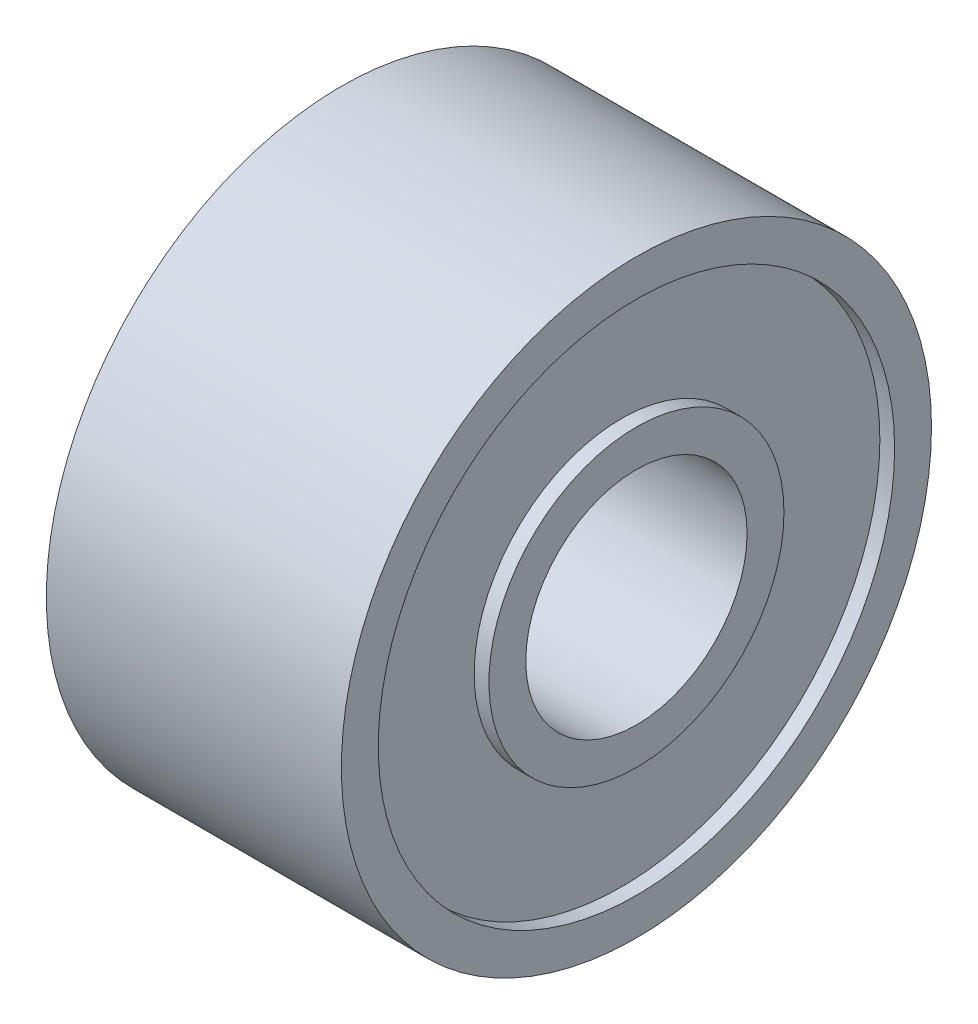
ISO-10303-21;
HEADER;
FILE_DESCRIPTION(('STEP AP214'),'2;1');
FILE_NAME('part.step','',(''),(''),'','','');
FILE_SCHEMA(('AUTOMOTIVE_DESIGN { 1 0 10303 214 1 1 1 1 }'));
ENDSEC;
DATA;
#1=APPLICATION_CONTEXT('core data for automotive mechanical design processes');
#2=APPLICATION_PROTOCOL_DEFINITION('international standard','automotive_design',2000,#1);
#3=PRODUCT_CONTEXT('',#1,'mechanical');
#4=PRODUCT('Part','Part','',(#3));
#5=PRODUCT_RELATED_PRODUCT_CATEGORY('part','',(#4));
#6=PRODUCT_DEFINITION_FORMATION('','',#4);
#7=PRODUCT_DEFINITION_CONTEXT('part definition',#1,'design');
#8=PRODUCT_DEFINITION('design','',#6,#7);
#9=PRODUCT_DEFINITION_SHAPE('','',#8);
#10=(LENGTH_UNIT() NAMED_UNIT(*) SI_UNIT(.MILLI.,.METRE.));
#11=(NAMED_UNIT(*) PLANE_ANGLE_UNIT() SI_UNIT($,.RADIAN.));
#12=(NAMED_UNIT(*) SI_UNIT($,.STERADIAN.) SOLID_ANGLE_UNIT());
#13=UNCERTAINTY_MEASURE_WITH_UNIT(LENGTH_MEASURE(1.E-05),#10,'distance_accuracy_value','');
#14=(GEOMETRIC_REPRESENTATION_CONTEXT(3) GLOBAL_UNCERTAINTY_ASSIGNED_CONTEXT((#13)) GLOBAL_UNIT_ASSIGNED_CONTEXT((#10,
#11,#12)) REPRESENTATION_CONTEXT('',''));
#15=CARTESIAN_POINT('',(0.,0.,0.));
#16=DIRECTION('',(0.,0.,1.));
#17=DIRECTION('',(1.,0.,0.));
#18=AXIS2_PLACEMENT_3D('',#15,#16,#17);
#19=CARTESIAN_POINT('',(0.,0.,0.));
#20=DIRECTION('',(1.,0.,0.));
#21=DIRECTION('',(0.,0.,-1.));
#22=AXIS2_PLACEMENT_3D('',#19,#20,#21);
#23=PLANE('',#22);
#24=CARTESIAN_POINT('',(0.,0.,0.));
#25=DIRECTION('',(1.,0.,0.));
#26=DIRECTION('',(0.,0.,-1.));
#27=AXIS2_PLACEMENT_3D('',#24,#25,#26);
#28=CIRCLE('',#27,1.5);
#29=CARTESIAN_POINT('',(0.,0.,-1.5));
#30=VERTEX_POINT('',#29);
#31=EDGE_CURVE('E44',#30,#30,#28,.T.);
#32=ORIENTED_EDGE('',*,*,#31,.T.);
#33=EDGE_LOOP('',(#32));
#34=FACE_BOUND('',#33,.T.);
#35=CARTESIAN_POINT('',(0.,0.,0.));
#36=DIRECTION('',(-1.,0.,0.));
#37=DIRECTION('',(0.,0.,1.));
#38=AXIS2_PLACEMENT_3D('',#35,#36,#37);
#39=CIRCLE('',#38,2.);
#40=CARTESIAN_POINT('',(0.,0.,2.));
#41=VERTEX_POINT('',#40);
#42=EDGE_CURVE('E68',#41,#41,#39,.T.);
#43=ORIENTED_EDGE('',*,*,#42,.T.);
#44=EDGE_LOOP('',(#43));
#45=FACE_BOUND('',#44,.T.);
#46=ADVANCED_FACE('F31',(#34,#45),#23,.F.);
#47=CARTESIAN_POINT('',(4.,0.,0.));
#48=DIRECTION('',(1.,0.,0.));
#49=DIRECTION('',(0.,0.,-1.));
#50=AXIS2_PLACEMENT_3D('',#47,#48,#49);
#51=PLANE('',#50);
#52=CARTESIAN_POINT('',(4.,0.,0.));
#53=DIRECTION('',(1.,0.,0.));
#54=DIRECTION('',(0.,0.,-1.));
#55=AXIS2_PLACEMENT_3D('',#52,#53,#54);
#56=CIRCLE('',#55,1.5);
#57=CARTESIAN_POINT('',(4.,0.,-1.5));
#58=VERTEX_POINT('',#57);
#59=EDGE_CURVE('E42',#58,#58,#56,.T.);
#60=ORIENTED_EDGE('',*,*,#59,.F.);
#61=EDGE_LOOP('',(#60));
#62=FACE_BOUND('',#61,.T.);
#63=CARTESIAN_POINT('',(4.,0.,0.));
#64=DIRECTION('',(1.,0.,0.));
#65=DIRECTION('',(0.,0.,-1.));
#66=AXIS2_PLACEMENT_3D('',#63,#64,#65);
#67=CIRCLE('',#66,2.);
#68=CARTESIAN_POINT('',(4.,0.,-2.));
#69=VERTEX_POINT('',#68);
#70=EDGE_CURVE('E56',#69,#69,#67,.T.);
#71=ORIENTED_EDGE('',*,*,#70,.T.);
#72=EDGE_LOOP('',(#71));
#73=FACE_BOUND('',#72,.T.);
#74=ADVANCED_FACE('F106',(#62,#73),#51,.T.);
#75=CARTESIAN_POINT('',(4.,0.,0.));
#76=DIRECTION('',(1.,0.,0.));
#77=DIRECTION('',(0.,0.,-1.));
#78=AXIS2_PLACEMENT_3D('',#75,#76,#77);
#79=CIRCLE('',#78,3.5);
#80=CARTESIAN_POINT('',(4.,0.,-3.5));
#81=VERTEX_POINT('',#80);
#82=EDGE_CURVE('E50',#81,#81,#79,.T.);
#83=ORIENTED_EDGE('',*,*,#82,.F.);
#84=EDGE_LOOP('',(#83));
#85=FACE_BOUND('',#84,.T.);
#86=CARTESIAN_POINT('',(4.,0.,0.));
#87=DIRECTION('',(1.,0.,0.));
#88=DIRECTION('',(0.,0.,-1.));
#89=AXIS2_PLACEMENT_3D('',#86,#87,#88);
#90=CIRCLE('',#89,4.);
#91=CARTESIAN_POINT('',(4.,0.,-4.));
#92=VERTEX_POINT('',#91);
#93=EDGE_CURVE('E10',#92,#92,#90,.T.);
#94=ORIENTED_EDGE('',*,*,#93,.T.);
#95=EDGE_LOOP('',(#94));
#96=FACE_BOUND('',#95,.T.);
#97=ADVANCED_FACE('F93',(#85,#96),#51,.T.);
#98=CARTESIAN_POINT('',(0.,0.,0.));
#99=DIRECTION('',(-1.,0.,0.));
#100=DIRECTION('',(0.,0.,1.));
#101=AXIS2_PLACEMENT_3D('',#98,#99,#100);
#102=CIRCLE('',#101,3.5);
#103=CARTESIAN_POINT('',(0.,0.,3.5));
#104=VERTEX_POINT('',#103);
#105=EDGE_CURVE('E62',#104,#104,#102,.T.);
#106=ORIENTED_EDGE('',*,*,#105,.F.);
#107=EDGE_LOOP('',(#106));
#108=FACE_BOUND('',#107,.T.);
#109=CARTESIAN_POINT('',(0.,0.,0.));
#110=DIRECTION('',(1.,0.,0.));
#111=DIRECTION('',(0.,0.,-1.));
#112=AXIS2_PLACEMENT_3D('',#109,#110,#111);
#113=CIRCLE('',#112,4.);
#114=CARTESIAN_POINT('',(0.,0.,-4.));
#115=VERTEX_POINT('',#114);
#116=EDGE_CURVE('E35',#115,#115,#113,.T.);
#117=ORIENTED_EDGE('',*,*,#116,.F.);
#118=EDGE_LOOP('',(#117));
#119=FACE_BOUND('',#118,.T.);
#120=ADVANCED_FACE('F90',(#108,#119),#23,.F.);
#121=CARTESIAN_POINT('',(4.,0.,0.));
#122=DIRECTION('',(-1.,0.,0.));
#123=DIRECTION('',(0.,0.,1.));
#124=AXIS2_PLACEMENT_3D('',#121,#122,#123);
#125=CYLINDRICAL_SURFACE('',#124,4.);
#126=ORIENTED_EDGE('',*,*,#93,.F.);
#127=EDGE_LOOP('',(#126));
#128=FACE_BOUND('',#127,.T.);
#129=ORIENTED_EDGE('',*,*,#116,.T.);
#130=EDGE_LOOP('',(#129));
#131=FACE_BOUND('',#130,.T.);
#132=ADVANCED_FACE('F33',(#128,#131),#125,.T.);
#133=CARTESIAN_POINT('',(4.,0.,0.));
#134=DIRECTION('',(-1.,0.,0.));
#135=DIRECTION('',(0.,0.,1.));
#136=AXIS2_PLACEMENT_3D('',#133,#134,#135);
#137=CYLINDRICAL_SURFACE('',#136,1.5);
#138=ORIENTED_EDGE('',*,*,#59,.T.);
#139=EDGE_LOOP('',(#138));
#140=FACE_BOUND('',#139,.T.);
#141=ORIENTED_EDGE('',*,*,#31,.F.);
#142=EDGE_LOOP('',(#141));
#143=FACE_BOUND('',#142,.T.);
#144=ADVANCED_FACE('F97',(#140,#143),#137,.F.);
#145=CARTESIAN_POINT('',(3.8,0.,0.));
#146=DIRECTION('',(1.,0.,0.));
#147=DIRECTION('',(0.,0.,-1.));
#148=AXIS2_PLACEMENT_3D('',#145,#146,#147);
#149=CYLINDRICAL_SURFACE('',#148,3.5);
#150=CARTESIAN_POINT('',(3.8,0.,0.));
#151=DIRECTION('',(1.,0.,0.));
#152=DIRECTION('',(0.,0.,-1.));
#153=AXIS2_PLACEMENT_3D('',#150,#151,#152);
#154=CIRCLE('',#153,3.5);
#155=CARTESIAN_POINT('',(3.8,0.,-3.5));
#156=VERTEX_POINT('',#155);
#157=EDGE_CURVE('E47',#156,#156,#154,.T.);
#158=ORIENTED_EDGE('',*,*,#157,.F.);
#159=EDGE_LOOP('',(#158));
#160=FACE_BOUND('',#159,.T.);
#161=ORIENTED_EDGE('',*,*,#82,.T.);
#162=EDGE_LOOP('',(#161));
#163=FACE_BOUND('',#162,.T.);
#164=ADVANCED_FACE('F102',(#160,#163),#149,.F.);
#165=CARTESIAN_POINT('',(3.8,0.,0.));
#166=DIRECTION('',(1.,0.,0.));
#167=DIRECTION('',(0.,0.,-1.));
#168=AXIS2_PLACEMENT_3D('',#165,#166,#167);
#169=PLANE('',#168);
#170=CARTESIAN_POINT('',(3.8,0.,0.));
#171=DIRECTION('',(1.,0.,0.));
#172=DIRECTION('',(0.,0.,-1.));
#173=AXIS2_PLACEMENT_3D('',#170,#171,#172);
#174=CIRCLE('',#173,2.);
#175=CARTESIAN_POINT('',(3.8,0.,-2.));
#176=VERTEX_POINT('',#175);
#177=EDGE_CURVE('E53',#176,#176,#174,.T.);
#178=ORIENTED_EDGE('',*,*,#177,.F.);
#179=EDGE_LOOP('',(#178));
#180=FACE_BOUND('',#179,.T.);
#181=ORIENTED_EDGE('',*,*,#157,.T.);
#182=EDGE_LOOP('',(#181));
#183=FACE_BOUND('',#182,.T.);
#184=ADVANCED_FACE('F119',(#180,#183),#169,.T.);
#185=CARTESIAN_POINT('',(3.8,0.,0.));
#186=DIRECTION('',(1.,0.,0.));
#187=DIRECTION('',(0.,0.,-1.));
#188=AXIS2_PLACEMENT_3D('',#185,#186,#187);
#189=CYLINDRICAL_SURFACE('',#188,2.);
#190=ORIENTED_EDGE('',*,*,#177,.T.);
#191=EDGE_LOOP('',(#190));
#192=FACE_BOUND('',#191,.T.);
#193=ORIENTED_EDGE('',*,*,#70,.F.);
#194=EDGE_LOOP('',(#193));
#195=FACE_BOUND('',#194,.T.);
#196=ADVANCED_FACE('F86',(#192,#195),#189,.T.);
#197=CARTESIAN_POINT('',(0.2,0.,0.));
#198=DIRECTION('',(-1.,0.,0.));
#199=DIRECTION('',(0.,0.,1.));
#200=AXIS2_PLACEMENT_3D('',#197,#198,#199);
#201=CYLINDRICAL_SURFACE('',#200,3.5);
#202=CARTESIAN_POINT('',(0.2,0.,0.));
#203=DIRECTION('',(-1.,0.,0.));
#204=DIRECTION('',(0.,0.,1.));
#205=AXIS2_PLACEMENT_3D('',#202,#203,#204);
#206=CIRCLE('',#205,3.5);
#207=CARTESIAN_POINT('',(0.2,0.,3.5));
#208=VERTEX_POINT('',#207);
#209=EDGE_CURVE('E59',#208,#208,#206,.T.);
#210=ORIENTED_EDGE('',*,*,#209,.F.);
#211=EDGE_LOOP('',(#210));
#212=FACE_BOUND('',#211,.T.);
#213=ORIENTED_EDGE('',*,*,#105,.T.);
#214=EDGE_LOOP('',(#213));
#215=FACE_BOUND('',#214,.T.);
#216=ADVANCED_FACE('F80',(#212,#215),#201,.F.);
#217=CARTESIAN_POINT('',(0.2,0.,0.));
#218=DIRECTION('',(-1.,0.,0.));
#219=DIRECTION('',(0.,0.,1.));
#220=AXIS2_PLACEMENT_3D('',#217,#218,#219);
#221=PLANE('',#220);
#222=CARTESIAN_POINT('',(0.2,0.,0.));
#223=DIRECTION('',(-1.,0.,0.));
#224=DIRECTION('',(0.,0.,1.));
#225=AXIS2_PLACEMENT_3D('',#222,#223,#224);
#226=CIRCLE('',#225,2.);
#227=CARTESIAN_POINT('',(0.2,0.,2.));
#228=VERTEX_POINT('',#227);
#229=EDGE_CURVE('E65',#228,#228,#226,.T.);
#230=ORIENTED_EDGE('',*,*,#229,.F.);
#231=EDGE_LOOP('',(#230));
#232=FACE_BOUND('',#231,.T.);
#233=ORIENTED_EDGE('',*,*,#209,.T.);
#234=EDGE_LOOP('',(#233));
#235=FACE_BOUND('',#234,.T.);
#236=ADVANCED_FACE('F77',(#232,#235),#221,.T.);
#237=CARTESIAN_POINT('',(0.2,0.,0.));
#238=DIRECTION('',(-1.,0.,0.));
#239=DIRECTION('',(0.,0.,1.));
#240=AXIS2_PLACEMENT_3D('',#237,#238,#239);
#241=CYLINDRICAL_SURFACE('',#240,2.);
#242=ORIENTED_EDGE('',*,*,#229,.T.);
#243=EDGE_LOOP('',(#242));
#244=FACE_BOUND('',#243,.T.);
#245=ORIENTED_EDGE('',*,*,#42,.F.);
#246=EDGE_LOOP('',(#245));
#247=FACE_BOUND('',#246,.T.);
#248=ADVANCED_FACE('F74',(#244,#247),#241,.T.);
#249=CLOSED_SHELL('',(#46,#74,#97,#120,#132,#144,#164,#184,#196,#216,#236,#248));
#250=MANIFOLD_SOLID_BREP('B2',#249);
#251=ADVANCED_BREP_SHAPE_REPRESENTATION('',(#18,#250),#14);
#252=SHAPE_DEFINITION_REPRESENTATION(#9,#251);
ENDSEC;
END-ISO-10303-21;
